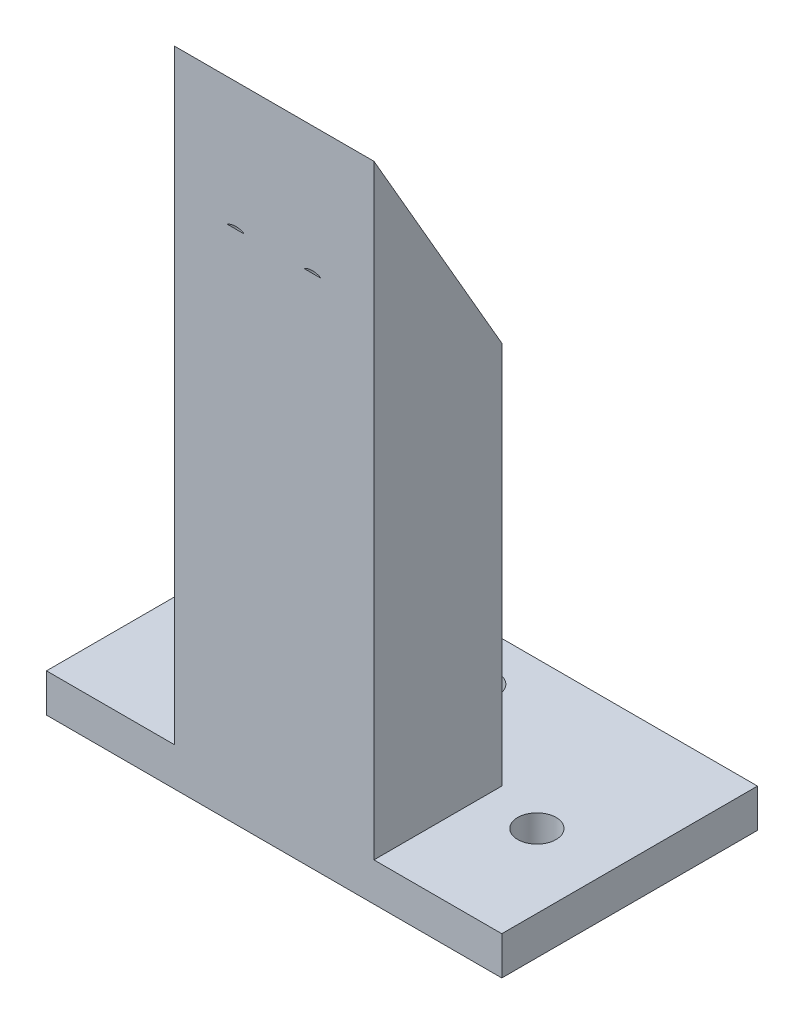
ISO-10303-21;
HEADER;
FILE_DESCRIPTION(('STEP AP214'),'2;1');
FILE_NAME('part.step','',(''),(''),'','','');
FILE_SCHEMA(('AUTOMOTIVE_DESIGN { 1 0 10303 214 1 1 1 1 }'));
ENDSEC;
DATA;
#1=APPLICATION_CONTEXT('core data for automotive mechanical design processes');
#2=APPLICATION_PROTOCOL_DEFINITION('international standard','automotive_design',2000,#1);
#3=PRODUCT_CONTEXT('',#1,'mechanical');
#4=PRODUCT('Part','Part','',(#3));
#5=PRODUCT_RELATED_PRODUCT_CATEGORY('part','',(#4));
#6=PRODUCT_DEFINITION_FORMATION('','',#4);
#7=PRODUCT_DEFINITION_CONTEXT('part definition',#1,'design');
#8=PRODUCT_DEFINITION('design','',#6,#7);
#9=PRODUCT_DEFINITION_SHAPE('','',#8);
#10=(LENGTH_UNIT() NAMED_UNIT(*) SI_UNIT(.MILLI.,.METRE.));
#11=(NAMED_UNIT(*) PLANE_ANGLE_UNIT() SI_UNIT($,.RADIAN.));
#12=(NAMED_UNIT(*) SI_UNIT($,.STERADIAN.) SOLID_ANGLE_UNIT());
#13=UNCERTAINTY_MEASURE_WITH_UNIT(LENGTH_MEASURE(1.E-05),#10,'distance_accuracy_value','');
#14=(GEOMETRIC_REPRESENTATION_CONTEXT(3) GLOBAL_UNCERTAINTY_ASSIGNED_CONTEXT((#13)) GLOBAL_UNIT_ASSIGNED_CONTEXT((#10,
#11,#12)) REPRESENTATION_CONTEXT('',''));
#15=CARTESIAN_POINT('',(0.,0.,0.));
#16=DIRECTION('',(0.,0.,1.));
#17=DIRECTION('',(1.,0.,0.));
#18=AXIS2_PLACEMENT_3D('',#15,#16,#17);
#19=CARTESIAN_POINT('',(0.,3.,-20.2499999999999));
#20=DIRECTION('',(0.,0.,-1.));
#21=DIRECTION('',(-1.,0.,0.));
#22=AXIS2_PLACEMENT_3D('',#19,#20,#21);
#23=PLANE('',#22);
#24=DIRECTION('',(1.,0.,0.));
#25=VECTOR('',#24,1.);
#26=CARTESIAN_POINT('',(0.,0.,-20.2499999999999));
#27=LINE('',#26,#25);
#28=CARTESIAN_POINT('',(-26.2417816091954,0.,-20.2499999999999));
#29=VERTEX_POINT('',#28);
#30=CARTESIAN_POINT('',(9.36821839080457,0.,-20.2499999999999));
#31=VERTEX_POINT('',#30);
#32=EDGE_CURVE('E190',#29,#31,#27,.T.);
#33=ORIENTED_EDGE('',*,*,#32,.F.);
#34=DIRECTION('',(0.,-1.,0.));
#35=VECTOR('',#34,1.);
#36=CARTESIAN_POINT('',(-26.2417816091954,3.,-20.2499999999999));
#37=LINE('',#36,#35);
#38=CARTESIAN_POINT('',(-26.2417816091954,3.,-20.2499999999999));
#39=VERTEX_POINT('',#38);
#40=EDGE_CURVE('E123',#39,#29,#37,.T.);
#41=ORIENTED_EDGE('',*,*,#40,.F.);
#42=DIRECTION('',(1.,0.,0.));
#43=VECTOR('',#42,1.);
#44=CARTESIAN_POINT('',(0.,3.,-20.2499999999999));
#45=LINE('',#44,#43);
#46=CARTESIAN_POINT('',(9.36821839080457,3.,-20.2499999999999));
#47=VERTEX_POINT('',#46);
#48=EDGE_CURVE('E191',#39,#47,#45,.T.);
#49=ORIENTED_EDGE('',*,*,#48,.T.);
#50=DIRECTION('',(0.,-1.,0.));
#51=VECTOR('',#50,1.);
#52=CARTESIAN_POINT('',(9.36821839080457,3.,-20.2499999999999));
#53=LINE('',#52,#51);
#54=EDGE_CURVE('E203',#47,#31,#53,.T.);
#55=ORIENTED_EDGE('',*,*,#54,.T.);
#56=EDGE_LOOP('',(#33,#41,#49,#55));
#57=FACE_BOUND('',#56,.T.);
#58=ADVANCED_FACE('F47',(#57),#23,.T.);
#59=CARTESIAN_POINT('',(-26.2417816091954,3.,0.));
#60=DIRECTION('',(1.,0.,0.));
#61=DIRECTION('',(0.,0.,-1.));
#62=AXIS2_PLACEMENT_3D('',#59,#60,#61);
#63=PLANE('',#62);
#64=DIRECTION('',(0.,0.,1.));
#65=VECTOR('',#64,1.);
#66=CARTESIAN_POINT('',(-26.2417816091954,0.,0.));
#67=LINE('',#66,#65);
#68=CARTESIAN_POINT('',(-26.2417816091954,0.,-0.249999999999893));
#69=VERTEX_POINT('',#68);
#70=EDGE_CURVE('E206',#29,#69,#67,.T.);
#71=ORIENTED_EDGE('',*,*,#70,.T.);
#72=DIRECTION('',(0.,-1.,0.));
#73=VECTOR('',#72,1.);
#74=CARTESIAN_POINT('',(-26.2417816091954,3.,-0.249999999999893));
#75=LINE('',#74,#73);
#76=CARTESIAN_POINT('',(-26.2417816091954,3.,-0.249999999999893));
#77=VERTEX_POINT('',#76);
#78=EDGE_CURVE('E216',#77,#69,#75,.T.);
#79=ORIENTED_EDGE('',*,*,#78,.F.);
#80=DIRECTION('',(0.,0.,1.));
#81=VECTOR('',#80,1.);
#82=CARTESIAN_POINT('',(-26.2417816091954,3.,0.));
#83=LINE('',#82,#81);
#84=EDGE_CURVE('E194',#39,#77,#83,.T.);
#85=ORIENTED_EDGE('',*,*,#84,.F.);
#86=ORIENTED_EDGE('',*,*,#40,.T.);
#87=EDGE_LOOP('',(#71,#79,#85,#86));
#88=FACE_BOUND('',#87,.T.);
#89=ADVANCED_FACE('F222',(#88),#63,.F.);
#90=CARTESIAN_POINT('',(0.,3.,-0.249999999999896));
#91=DIRECTION('',(0.,0.,-1.));
#92=DIRECTION('',(-1.,0.,0.));
#93=AXIS2_PLACEMENT_3D('',#90,#91,#92);
#94=PLANE('',#93);
#95=DIRECTION('',(1.,0.,0.));
#96=VECTOR('',#95,1.);
#97=CARTESIAN_POINT('',(0.,40.3205080756888,-0.249999999999896));
#98=LINE('',#97,#96);
#99=CARTESIAN_POINT('',(-12.111378345689,40.3205080756888,-0.249999999999892));
#100=VERTEX_POINT('',#99);
#101=CARTESIAN_POINT('',(-10.7621848727018,40.3205080756888,-0.249999999999892));
#102=VERTEX_POINT('',#101);
#103=EDGE_CURVE('E13',#100,#102,#98,.T.);
#104=ORIENTED_EDGE('',*,*,#103,.F.);
#105=CARTESIAN_POINT('',(-11.4367816091954,38.7735026918963,-0.249999999999895));
#106=DIRECTION('',(0.,0.,-1.));
#107=DIRECTION('',(0.,1.,0.));
#108=AXIS2_PLACEMENT_3D('',#105,#106,#107);
#109=ELLIPSE('',#108,1.73205080756888,1.5);
#110=EDGE_CURVE('E132',#100,#102,#109,.T.);
#111=ORIENTED_EDGE('',*,*,#110,.T.);
#112=EDGE_LOOP('',(#104,#111));
#113=FACE_BOUND('',#112,.T.);
#114=DIRECTION('',(1.,0.,0.));
#115=VECTOR('',#114,1.);
#116=CARTESIAN_POINT('',(0.,40.3205080756888,-0.249999999999896));
#117=LINE('',#116,#115);
#118=CARTESIAN_POINT('',(-6.11137834568902,40.3205080756888,-0.249999999999893));
#119=VERTEX_POINT('',#118);
#120=CARTESIAN_POINT('',(-4.76218487270184,40.3205080756888,-0.249999999999893));
#121=VERTEX_POINT('',#120);
#122=EDGE_CURVE('E54',#119,#121,#117,.T.);
#123=ORIENTED_EDGE('',*,*,#122,.F.);
#124=CARTESIAN_POINT('',(-5.43678160919543,38.7735026918963,-0.249999999999895));
#125=DIRECTION('',(0.,0.,-1.));
#126=DIRECTION('',(0.,1.,0.));
#127=AXIS2_PLACEMENT_3D('',#124,#125,#126);
#128=ELLIPSE('',#127,1.73205080756888,1.5);
#129=EDGE_CURVE('E126',#119,#121,#128,.T.);
#130=ORIENTED_EDGE('',*,*,#129,.T.);
#131=EDGE_LOOP('',(#123,#130));
#132=FACE_BOUND('',#131,.T.);
#133=DIRECTION('',(1.,0.,0.));
#134=VECTOR('',#133,1.);
#135=CARTESIAN_POINT('',(0.,0.,-0.249999999999896));
#136=LINE('',#135,#134);
#137=CARTESIAN_POINT('',(9.36821839080457,0.,-0.249999999999897));
#138=VERTEX_POINT('',#137);
#139=EDGE_CURVE('E208',#69,#138,#136,.T.);
#140=ORIENTED_EDGE('',*,*,#139,.T.);
#141=DIRECTION('',(0.,-1.,0.));
#142=VECTOR('',#141,1.);
#143=CARTESIAN_POINT('',(9.36821839080457,3.,-0.249999999999897));
#144=LINE('',#143,#142);
#145=CARTESIAN_POINT('',(9.36821839080457,3.,-0.249999999999897));
#146=VERTEX_POINT('',#145);
#147=EDGE_CURVE('E214',#146,#138,#144,.T.);
#148=ORIENTED_EDGE('',*,*,#147,.F.);
#149=DIRECTION('',(1.,0.,0.));
#150=VECTOR('',#149,1.);
#151=CARTESIAN_POINT('',(0.,3.,-0.249999999999896));
#152=LINE('',#151,#150);
#153=CARTESIAN_POINT('',(-0.631781609195428,3.,-0.249999999999896));
#154=VERTEX_POINT('',#153);
#155=EDGE_CURVE('E197',#154,#146,#152,.T.);
#156=ORIENTED_EDGE('',*,*,#155,.F.);
#157=DIRECTION('',(0.,-1.,0.));
#158=VECTOR('',#157,1.);
#159=CARTESIAN_POINT('',(-0.631781609195427,33.,-0.249999999999888));
#160=LINE('',#159,#158);
#161=CARTESIAN_POINT('',(-0.631781609195428,50.3205080756889,-0.249999999999889));
#162=VERTEX_POINT('',#161);
#163=EDGE_CURVE('E166',#162,#154,#160,.T.);
#164=ORIENTED_EDGE('',*,*,#163,.F.);
#165=DIRECTION('',(-1.,0.,0.));
#166=VECTOR('',#165,1.);
#167=CARTESIAN_POINT('',(19.3682183908047,50.3205080756889,-0.249999999999889));
#168=LINE('',#167,#166);
#169=CARTESIAN_POINT('',(-16.2417816091954,50.3205080756889,-0.249999999999889));
#170=VERTEX_POINT('',#169);
#171=EDGE_CURVE('E144',#162,#170,#168,.T.);
#172=ORIENTED_EDGE('',*,*,#171,.T.);
#173=DIRECTION('',(0.,-1.,0.));
#174=VECTOR('',#173,1.);
#175=CARTESIAN_POINT('',(-16.2417816091954,33.,-0.249999999999888));
#176=LINE('',#175,#174);
#177=CARTESIAN_POINT('',(-16.2417816091954,3.,-0.249999999999894));
#178=VERTEX_POINT('',#177);
#179=EDGE_CURVE('E169',#170,#178,#176,.T.);
#180=ORIENTED_EDGE('',*,*,#179,.T.);
#181=EDGE_CURVE('E198',#77,#178,#152,.T.);
#182=ORIENTED_EDGE('',*,*,#181,.F.);
#183=ORIENTED_EDGE('',*,*,#78,.T.);
#184=EDGE_LOOP('',(#140,#148,#156,#164,#172,#180,#182,#183));
#185=FACE_BOUND('',#184,.T.);
#186=ADVANCED_FACE('F130',(#113,#132,#185),#94,.F.);
#187=CARTESIAN_POINT('',(9.36821839080457,3.,0.));
#188=DIRECTION('',(1.,0.,0.));
#189=DIRECTION('',(0.,0.,-1.));
#190=AXIS2_PLACEMENT_3D('',#187,#188,#189);
#191=PLANE('',#190);
#192=DIRECTION('',(0.,0.,1.));
#193=VECTOR('',#192,1.);
#194=CARTESIAN_POINT('',(9.36821839080457,0.,0.));
#195=LINE('',#194,#193);
#196=EDGE_CURVE('E195',#31,#138,#195,.T.);
#197=ORIENTED_EDGE('',*,*,#196,.F.);
#198=ORIENTED_EDGE('',*,*,#54,.F.);
#199=DIRECTION('',(0.,0.,1.));
#200=VECTOR('',#199,1.);
#201=CARTESIAN_POINT('',(9.36821839080457,3.,0.));
#202=LINE('',#201,#200);
#203=EDGE_CURVE('E200',#47,#146,#202,.T.);
#204=ORIENTED_EDGE('',*,*,#203,.T.);
#205=ORIENTED_EDGE('',*,*,#147,.T.);
#206=EDGE_LOOP('',(#197,#198,#204,#205));
#207=FACE_BOUND('',#206,.T.);
#208=ADVANCED_FACE('F233',(#207),#191,.T.);
#209=CARTESIAN_POINT('',(0.,3.,0.));
#210=DIRECTION('',(0.,1.,0.));
#211=DIRECTION('',(0.,0.,1.));
#212=AXIS2_PLACEMENT_3D('',#209,#210,#211);
#213=PLANE('',#212);
#214=DIRECTION('',(0.,0.,1.));
#215=VECTOR('',#214,1.);
#216=CARTESIAN_POINT('',(-16.2417816091954,3.,-10.2499999999999));
#217=LINE('',#216,#215);
#218=CARTESIAN_POINT('',(-16.2417816091954,3.,-10.2499999999999));
#219=VERTEX_POINT('',#218);
#220=EDGE_CURVE('E143',#219,#178,#217,.T.);
#221=ORIENTED_EDGE('',*,*,#220,.F.);
#222=DIRECTION('',(-1.,0.,0.));
#223=VECTOR('',#222,1.);
#224=CARTESIAN_POINT('',(-16.2417816091954,3.,-10.2499999999999));
#225=LINE('',#224,#223);
#226=CARTESIAN_POINT('',(-0.631781609195429,3.,-10.2499999999999));
#227=VERTEX_POINT('',#226);
#228=EDGE_CURVE('E153',#227,#219,#225,.T.);
#229=ORIENTED_EDGE('',*,*,#228,.F.);
#230=DIRECTION('',(0.,0.,-1.));
#231=VECTOR('',#230,1.);
#232=CARTESIAN_POINT('',(-0.631781609195429,3.,-10.2499999999999));
#233=LINE('',#232,#231);
#234=EDGE_CURVE('E156',#154,#227,#233,.T.);
#235=ORIENTED_EDGE('',*,*,#234,.F.);
#236=ORIENTED_EDGE('',*,*,#155,.T.);
#237=ORIENTED_EDGE('',*,*,#203,.F.);
#238=ORIENTED_EDGE('',*,*,#48,.F.);
#239=ORIENTED_EDGE('',*,*,#84,.T.);
#240=ORIENTED_EDGE('',*,*,#181,.T.);
#241=EDGE_LOOP('',(#221,#229,#235,#236,#237,#238,#239,#240));
#242=FACE_BOUND('',#241,.T.);
#243=CARTESIAN_POINT('',(-20.4846874180152,3.,-8.74999999999995));
#244=DIRECTION('',(0.,1.,0.));
#245=DIRECTION('',(0.,0.,1.));
#246=AXIS2_PLACEMENT_3D('',#243,#244,#245);
#247=CIRCLE('',#246,1.5);
#248=CARTESIAN_POINT('',(-20.4846874180152,3.,-7.24999999999995));
#249=VERTEX_POINT('',#248);
#250=EDGE_CURVE('E187',#249,#249,#247,.T.);
#251=ORIENTED_EDGE('',*,*,#250,.F.);
#252=EDGE_LOOP('',(#251));
#253=FACE_BOUND('',#252,.T.);
#254=CARTESIAN_POINT('',(-8.43487721301594,3.,-16.2499999999999));
#255=DIRECTION('',(0.,1.,0.));
#256=DIRECTION('',(0.,0.,1.));
#257=AXIS2_PLACEMENT_3D('',#254,#255,#256);
#258=CIRCLE('',#257,1.5);
#259=CARTESIAN_POINT('',(-8.43487721301594,3.,-14.7499999999999));
#260=VERTEX_POINT('',#259);
#261=EDGE_CURVE('E184',#260,#260,#258,.T.);
#262=ORIENTED_EDGE('',*,*,#261,.F.);
#263=EDGE_LOOP('',(#262));
#264=FACE_BOUND('',#263,.T.);
#265=CARTESIAN_POINT('',(3.61493299198335,3.,-8.74999999999995));
#266=DIRECTION('',(0.,1.,0.));
#267=DIRECTION('',(0.,0.,1.));
#268=AXIS2_PLACEMENT_3D('',#265,#266,#267);
#269=CIRCLE('',#268,1.5);
#270=CARTESIAN_POINT('',(3.61493299198335,3.,-7.24999999999995));
#271=VERTEX_POINT('',#270);
#272=EDGE_CURVE('E176',#271,#271,#269,.T.);
#273=ORIENTED_EDGE('',*,*,#272,.F.);
#274=EDGE_LOOP('',(#273));
#275=FACE_BOUND('',#274,.T.);
#276=ADVANCED_FACE('F238',(#242,#253,#264,#275),#213,.T.);
#277=CARTESIAN_POINT('',(0.,0.,0.));
#278=DIRECTION('',(0.,1.,0.));
#279=DIRECTION('',(0.,0.,1.));
#280=AXIS2_PLACEMENT_3D('',#277,#278,#279);
#281=PLANE('',#280);
#282=CARTESIAN_POINT('',(-20.4846874180152,0.,-8.74999999999995));
#283=DIRECTION('',(0.,-1.,0.));
#284=DIRECTION('',(0.,0.,-1.));
#285=AXIS2_PLACEMENT_3D('',#282,#283,#284);
#286=CIRCLE('',#285,1.5);
#287=CARTESIAN_POINT('',(-20.4846874180152,0.,-10.25));
#288=VERTEX_POINT('',#287);
#289=EDGE_CURVE('E173',#288,#288,#286,.T.);
#290=ORIENTED_EDGE('',*,*,#289,.F.);
#291=EDGE_LOOP('',(#290));
#292=FACE_BOUND('',#291,.T.);
#293=CARTESIAN_POINT('',(-8.43487721301594,0.,-16.2499999999999));
#294=DIRECTION('',(0.,-1.,0.));
#295=DIRECTION('',(0.,0.,-1.));
#296=AXIS2_PLACEMENT_3D('',#293,#294,#295);
#297=CIRCLE('',#296,1.5);
#298=CARTESIAN_POINT('',(-8.43487721301594,0.,-17.7499999999999));
#299=VERTEX_POINT('',#298);
#300=EDGE_CURVE('E177',#299,#299,#297,.T.);
#301=ORIENTED_EDGE('',*,*,#300,.F.);
#302=EDGE_LOOP('',(#301));
#303=FACE_BOUND('',#302,.T.);
#304=CARTESIAN_POINT('',(3.61493299198335,0.,-8.74999999999995));
#305=DIRECTION('',(0.,-1.,0.));
#306=DIRECTION('',(0.,0.,-1.));
#307=AXIS2_PLACEMENT_3D('',#304,#305,#306);
#308=CIRCLE('',#307,1.5);
#309=CARTESIAN_POINT('',(3.61493299198335,0.,-10.25));
#310=VERTEX_POINT('',#309);
#311=EDGE_CURVE('E172',#310,#310,#308,.T.);
#312=ORIENTED_EDGE('',*,*,#311,.F.);
#313=EDGE_LOOP('',(#312));
#314=FACE_BOUND('',#313,.T.);
#315=ORIENTED_EDGE('',*,*,#32,.T.);
#316=ORIENTED_EDGE('',*,*,#196,.T.);
#317=ORIENTED_EDGE('',*,*,#139,.F.);
#318=ORIENTED_EDGE('',*,*,#70,.F.);
#319=EDGE_LOOP('',(#315,#316,#317,#318));
#320=FACE_BOUND('',#319,.T.);
#321=ADVANCED_FACE('F229',(#292,#303,#314,#320),#281,.F.);
#322=CARTESIAN_POINT('',(3.61493299198335,5.,-8.74999999999995));
#323=DIRECTION('',(0.,-1.,0.));
#324=DIRECTION('',(0.,0.,-1.));
#325=AXIS2_PLACEMENT_3D('',#322,#323,#324);
#326=CYLINDRICAL_SURFACE('',#325,1.5);
#327=ORIENTED_EDGE('',*,*,#272,.T.);
#328=EDGE_LOOP('',(#327));
#329=FACE_BOUND('',#328,.T.);
#330=ORIENTED_EDGE('',*,*,#311,.T.);
#331=EDGE_LOOP('',(#330));
#332=FACE_BOUND('',#331,.T.);
#333=ADVANCED_FACE('F275',(#329,#332),#326,.F.);
#334=CARTESIAN_POINT('',(-8.43487721301594,5.,-16.2499999999999));
#335=DIRECTION('',(0.,-1.,0.));
#336=DIRECTION('',(0.,0.,-1.));
#337=AXIS2_PLACEMENT_3D('',#334,#335,#336);
#338=CYLINDRICAL_SURFACE('',#337,1.5);
#339=ORIENTED_EDGE('',*,*,#261,.T.);
#340=EDGE_LOOP('',(#339));
#341=FACE_BOUND('',#340,.T.);
#342=ORIENTED_EDGE('',*,*,#300,.T.);
#343=EDGE_LOOP('',(#342));
#344=FACE_BOUND('',#343,.T.);
#345=ADVANCED_FACE('F281',(#341,#344),#338,.F.);
#346=CARTESIAN_POINT('',(-20.4846874180152,5.,-8.74999999999995));
#347=DIRECTION('',(0.,-1.,0.));
#348=DIRECTION('',(0.,0.,-1.));
#349=AXIS2_PLACEMENT_3D('',#346,#347,#348);
#350=CYLINDRICAL_SURFACE('',#349,1.5);
#351=ORIENTED_EDGE('',*,*,#250,.T.);
#352=EDGE_LOOP('',(#351));
#353=FACE_BOUND('',#352,.T.);
#354=ORIENTED_EDGE('',*,*,#289,.T.);
#355=EDGE_LOOP('',(#354));
#356=FACE_BOUND('',#355,.T.);
#357=ADVANCED_FACE('F285',(#353,#356),#350,.F.);
#358=CARTESIAN_POINT('',(-16.2417816091954,33.,-10.2499999999999));
#359=DIRECTION('',(1.,0.,0.));
#360=DIRECTION('',(0.,0.,-1.));
#361=AXIS2_PLACEMENT_3D('',#358,#359,#360);
#362=PLANE('',#361);
#363=ORIENTED_EDGE('',*,*,#220,.T.);
#364=ORIENTED_EDGE('',*,*,#179,.F.);
#365=DIRECTION('',(0.,-0.86602540378444,-0.499999999999998));
#366=VECTOR('',#365,1.);
#367=CARTESIAN_POINT('',(-16.2417816091954,33.,-10.2499999999999));
#368=LINE('',#367,#366);
#369=CARTESIAN_POINT('',(-16.2417816091954,33.,-10.2499999999999));
#370=VERTEX_POINT('',#369);
#371=EDGE_CURVE('E135',#170,#370,#368,.T.);
#372=ORIENTED_EDGE('',*,*,#371,.T.);
#373=DIRECTION('',(0.,-1.,0.));
#374=VECTOR('',#373,1.);
#375=CARTESIAN_POINT('',(-16.2417816091954,33.,-10.2499999999999));
#376=LINE('',#375,#374);
#377=EDGE_CURVE('E152',#370,#219,#376,.T.);
#378=ORIENTED_EDGE('',*,*,#377,.T.);
#379=EDGE_LOOP('',(#363,#364,#372,#378));
#380=FACE_BOUND('',#379,.T.);
#381=ADVANCED_FACE('F249',(#380),#362,.F.);
#382=CARTESIAN_POINT('',(-0.631781609195429,33.,-10.2499999999999));
#383=DIRECTION('',(-1.,0.,0.));
#384=DIRECTION('',(0.,0.,1.));
#385=AXIS2_PLACEMENT_3D('',#382,#383,#384);
#386=PLANE('',#385);
#387=ORIENTED_EDGE('',*,*,#234,.T.);
#388=DIRECTION('',(0.,-1.,0.));
#389=VECTOR('',#388,1.);
#390=CARTESIAN_POINT('',(-0.631781609195429,33.,-10.2499999999999));
#391=LINE('',#390,#389);
#392=CARTESIAN_POINT('',(-0.631781609195429,33.,-10.2499999999999));
#393=VERTEX_POINT('',#392);
#394=EDGE_CURVE('E163',#393,#227,#391,.T.);
#395=ORIENTED_EDGE('',*,*,#394,.F.);
#396=DIRECTION('',(0.,0.86602540378444,0.499999999999998));
#397=VECTOR('',#396,1.);
#398=CARTESIAN_POINT('',(-0.631781609195428,33.,-10.2499999999999));
#399=LINE('',#398,#397);
#400=EDGE_CURVE('E140',#393,#162,#399,.T.);
#401=ORIENTED_EDGE('',*,*,#400,.T.);
#402=ORIENTED_EDGE('',*,*,#163,.T.);
#403=EDGE_LOOP('',(#387,#395,#401,#402));
#404=FACE_BOUND('',#403,.T.);
#405=ADVANCED_FACE('F241',(#404),#386,.F.);
#406=CARTESIAN_POINT('',(-16.2417816091954,33.,-10.2499999999999));
#407=DIRECTION('',(0.,0.,1.));
#408=DIRECTION('',(1.,0.,0.));
#409=AXIS2_PLACEMENT_3D('',#406,#407,#408);
#410=PLANE('',#409);
#411=ORIENTED_EDGE('',*,*,#228,.T.);
#412=ORIENTED_EDGE('',*,*,#377,.F.);
#413=DIRECTION('',(-1.,0.,0.));
#414=VECTOR('',#413,1.);
#415=CARTESIAN_POINT('',(-16.2417816091954,33.,-10.2499999999999));
#416=LINE('',#415,#414);
#417=EDGE_CURVE('E149',#393,#370,#416,.T.);
#418=ORIENTED_EDGE('',*,*,#417,.F.);
#419=ORIENTED_EDGE('',*,*,#394,.T.);
#420=EDGE_LOOP('',(#411,#412,#418,#419));
#421=FACE_BOUND('',#420,.T.);
#422=ADVANCED_FACE('F251',(#421),#410,.F.);
#423=CARTESIAN_POINT('',(19.3682183908047,33.,-10.2499999999999));
#424=DIRECTION('',(0.,0.499999999999998,-0.86602540378444));
#425=DIRECTION('',(0.,0.86602540378444,0.499999999999998));
#426=AXIS2_PLACEMENT_3D('',#423,#424,#425);
#427=PLANE('',#426);
#428=CARTESIAN_POINT('',(-11.4367816091954,41.6602540378444,-5.24999999999988));
#429=DIRECTION('',(0.,0.499999999999998,-0.86602540378444));
#430=DIRECTION('',(0.,0.86602540378444,0.499999999999998));
#431=AXIS2_PLACEMENT_3D('',#428,#429,#430);
#432=CIRCLE('',#431,1.5);
#433=CARTESIAN_POINT('',(-11.4367816091954,42.9592921435211,-4.49999999999989));
#434=VERTEX_POINT('',#433);
#435=EDGE_CURVE('E127',#434,#434,#432,.T.);
#436=ORIENTED_EDGE('',*,*,#435,.F.);
#437=EDGE_LOOP('',(#436));
#438=FACE_BOUND('',#437,.T.);
#439=CARTESIAN_POINT('',(-5.43678160919543,41.6602540378444,-5.24999999999988));
#440=DIRECTION('',(0.,0.499999999999998,-0.86602540378444));
#441=DIRECTION('',(0.,0.86602540378444,0.499999999999998));
#442=AXIS2_PLACEMENT_3D('',#439,#440,#441);
#443=CIRCLE('',#442,1.5);
#444=CARTESIAN_POINT('',(-5.43678160919543,42.9592921435211,-4.49999999999989));
#445=VERTEX_POINT('',#444);
#446=EDGE_CURVE('E128',#445,#445,#443,.T.);
#447=ORIENTED_EDGE('',*,*,#446,.F.);
#448=EDGE_LOOP('',(#447));
#449=FACE_BOUND('',#448,.T.);
#450=ORIENTED_EDGE('',*,*,#400,.F.);
#451=ORIENTED_EDGE('',*,*,#417,.T.);
#452=ORIENTED_EDGE('',*,*,#371,.F.);
#453=ORIENTED_EDGE('',*,*,#171,.F.);
#454=EDGE_LOOP('',(#450,#451,#452,#453));
#455=FACE_BOUND('',#454,.T.);
#456=ADVANCED_FACE('F247',(#438,#449,#455),#427,.T.);
#457=CARTESIAN_POINT('',(-5.43678160919543,39.1602540378445,-0.919872981077684));
#458=DIRECTION('',(0.,0.499999999999998,-0.86602540378444));
#459=DIRECTION('',(0.,0.86602540378444,0.499999999999998));
#460=AXIS2_PLACEMENT_3D('',#457,#458,#459);
#461=PLANE('',#460);
#462=ORIENTED_EDGE('',*,*,#122,.T.);
#463=CARTESIAN_POINT('',(-5.43678160919543,39.1602540378445,-0.919872981077684));
#464=DIRECTION('',(0.,0.499999999999998,-0.86602540378444));
#465=DIRECTION('',(0.,0.86602540378444,0.499999999999998));
#466=AXIS2_PLACEMENT_3D('',#463,#464,#465);
#467=CIRCLE('',#466,1.5);
#468=EDGE_CURVE('E66',#121,#119,#467,.T.);
#469=ORIENTED_EDGE('',*,*,#468,.T.);
#470=EDGE_LOOP('',(#462,#469));
#471=FACE_BOUND('',#470,.T.);
#472=ADVANCED_FACE('F120',(#471),#461,.T.);
#473=CARTESIAN_POINT('',(-5.43678160919543,39.1602540378445,-0.919872981077684));
#474=DIRECTION('',(0.,0.499999999999998,-0.86602540378444));
#475=DIRECTION('',(0.,0.86602540378444,0.499999999999998));
#476=AXIS2_PLACEMENT_3D('',#473,#474,#475);
#477=CYLINDRICAL_SURFACE('',#476,1.5);
#478=ORIENTED_EDGE('',*,*,#446,.T.);
#479=EDGE_LOOP('',(#478));
#480=FACE_BOUND('',#479,.T.);
#481=ORIENTED_EDGE('',*,*,#468,.F.);
#482=ORIENTED_EDGE('',*,*,#129,.F.);
#483=EDGE_LOOP('',(#481,#482));
#484=FACE_BOUND('',#483,.T.);
#485=ADVANCED_FACE('F125',(#480,#484),#477,.F.);
#486=CARTESIAN_POINT('',(-11.4367816091954,39.1602540378445,-0.919872981077684));
#487=DIRECTION('',(0.,0.499999999999998,-0.86602540378444));
#488=DIRECTION('',(0.,0.86602540378444,0.499999999999998));
#489=AXIS2_PLACEMENT_3D('',#486,#487,#488);
#490=PLANE('',#489);
#491=ORIENTED_EDGE('',*,*,#103,.T.);
#492=CARTESIAN_POINT('',(-11.4367816091954,39.1602540378445,-0.919872981077684));
#493=DIRECTION('',(0.,0.499999999999998,-0.86602540378444));
#494=DIRECTION('',(0.,0.86602540378444,0.499999999999998));
#495=AXIS2_PLACEMENT_3D('',#492,#493,#494);
#496=CIRCLE('',#495,1.5);
#497=EDGE_CURVE('E59',#102,#100,#496,.T.);
#498=ORIENTED_EDGE('',*,*,#497,.T.);
#499=EDGE_LOOP('',(#491,#498));
#500=FACE_BOUND('',#499,.T.);
#501=ADVANCED_FACE('F335',(#500),#490,.T.);
#502=CARTESIAN_POINT('',(-11.4367816091954,39.1602540378445,-0.919872981077684));
#503=DIRECTION('',(0.,0.499999999999998,-0.86602540378444));
#504=DIRECTION('',(0.,0.86602540378444,0.499999999999998));
#505=AXIS2_PLACEMENT_3D('',#502,#503,#504);
#506=CYLINDRICAL_SURFACE('',#505,1.5);
#507=ORIENTED_EDGE('',*,*,#435,.T.);
#508=EDGE_LOOP('',(#507));
#509=FACE_BOUND('',#508,.T.);
#510=ORIENTED_EDGE('',*,*,#497,.F.);
#511=ORIENTED_EDGE('',*,*,#110,.F.);
#512=EDGE_LOOP('',(#510,#511));
#513=FACE_BOUND('',#512,.T.);
#514=ADVANCED_FACE('F345',(#509,#513),#506,.F.);
#515=CLOSED_SHELL('',(#58,#89,#186,#208,#276,#321,#333,#345,#357,#381,#405,#422,#456,#472,#485,
#501,#514));
#516=MANIFOLD_SOLID_BREP('B2',#515);
#517=ADVANCED_BREP_SHAPE_REPRESENTATION('',(#18,#516),#14);
#518=SHAPE_DEFINITION_REPRESENTATION(#9,#517);
ENDSEC;
END-ISO-10303-21;
